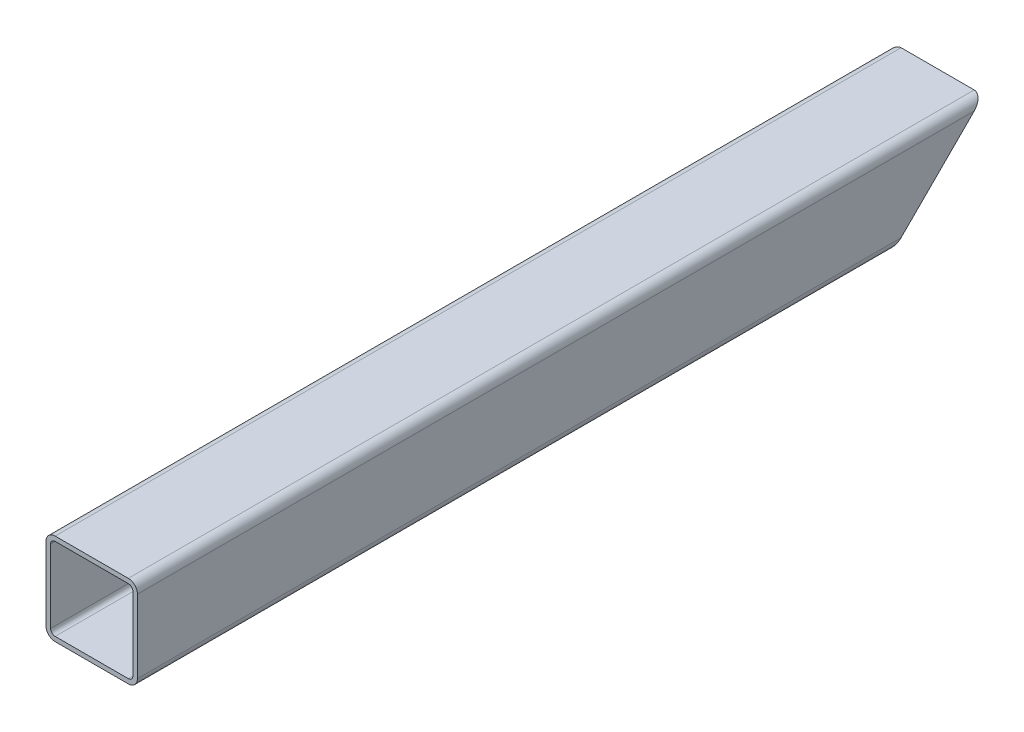
ISO-10303-21;
HEADER;
FILE_DESCRIPTION(('STEP AP214'),'2;1');
FILE_NAME('part.step','',(''),(''),'','','');
FILE_SCHEMA(('AUTOMOTIVE_DESIGN { 1 0 10303 214 1 1 1 1 }'));
ENDSEC;
DATA;
#1=APPLICATION_CONTEXT('core data for automotive mechanical design processes');
#2=APPLICATION_PROTOCOL_DEFINITION('international standard','automotive_design',2000,#1);
#3=PRODUCT_CONTEXT('',#1,'mechanical');
#4=PRODUCT('Part','Part','',(#3));
#5=PRODUCT_RELATED_PRODUCT_CATEGORY('part','',(#4));
#6=PRODUCT_DEFINITION_FORMATION('','',#4);
#7=PRODUCT_DEFINITION_CONTEXT('part definition',#1,'design');
#8=PRODUCT_DEFINITION('design','',#6,#7);
#9=PRODUCT_DEFINITION_SHAPE('','',#8);
#10=(LENGTH_UNIT() NAMED_UNIT(*) SI_UNIT(.MILLI.,.METRE.));
#11=(NAMED_UNIT(*) PLANE_ANGLE_UNIT() SI_UNIT($,.RADIAN.));
#12=(NAMED_UNIT(*) SI_UNIT($,.STERADIAN.) SOLID_ANGLE_UNIT());
#13=UNCERTAINTY_MEASURE_WITH_UNIT(LENGTH_MEASURE(1.E-05),#10,'distance_accuracy_value','');
#14=(GEOMETRIC_REPRESENTATION_CONTEXT(3) GLOBAL_UNCERTAINTY_ASSIGNED_CONTEXT((#13)) GLOBAL_UNIT_ASSIGNED_CONTEXT((#10,
#11,#12)) REPRESENTATION_CONTEXT('',''));
#15=CARTESIAN_POINT('',(0.,0.,0.));
#16=DIRECTION('',(0.,0.,1.));
#17=DIRECTION('',(1.,0.,0.));
#18=AXIS2_PLACEMENT_3D('',#15,#16,#17);
#19=CARTESIAN_POINT('',(16.,-16.,-370.));
#20=DIRECTION('',(0.,0.,1.));
#21=DIRECTION('',(-1.,0.,0.));
#22=AXIS2_PLACEMENT_3D('',#19,#20,#21);
#23=CYLINDRICAL_SURFACE('',#22,4.);
#24=CARTESIAN_POINT('',(16.,-16.,-334.));
#25=DIRECTION('',(0.,0.707106781186544,0.707106781186551));
#26=DIRECTION('',(0.,-0.707106781186551,0.707106781186544));
#27=AXIS2_PLACEMENT_3D('',#24,#25,#26);
#28=ELLIPSE('',#27,5.65685424949235,4.);
#29=CARTESIAN_POINT('',(16.,-20.,-330.));
#30=VERTEX_POINT('',#29);
#31=CARTESIAN_POINT('',(20.,-16.,-334.));
#32=VERTEX_POINT('',#31);
#33=EDGE_CURVE('E159',#30,#32,#28,.T.);
#34=ORIENTED_EDGE('',*,*,#33,.T.);
#35=DIRECTION('',(0.,0.,1.));
#36=VECTOR('',#35,1.);
#37=CARTESIAN_POINT('',(20.,-16.,-370.));
#38=LINE('',#37,#36);
#39=CARTESIAN_POINT('',(20.,-16.,0.));
#40=VERTEX_POINT('',#39);
#41=EDGE_CURVE('E44',#32,#40,#38,.T.);
#42=ORIENTED_EDGE('',*,*,#41,.T.);
#43=CARTESIAN_POINT('',(16.,-16.,0.));
#44=DIRECTION('',(0.,0.,1.));
#45=DIRECTION('',(-1.,0.,0.));
#46=AXIS2_PLACEMENT_3D('',#43,#44,#45);
#47=CIRCLE('',#46,4.);
#48=CARTESIAN_POINT('',(16.,-20.,0.));
#49=VERTEX_POINT('',#48);
#50=EDGE_CURVE('E161',#49,#40,#47,.T.);
#51=ORIENTED_EDGE('',*,*,#50,.F.);
#52=DIRECTION('',(0.,0.,1.));
#53=VECTOR('',#52,1.);
#54=CARTESIAN_POINT('',(16.,-20.,-370.));
#55=LINE('',#54,#53);
#56=EDGE_CURVE('E149',#30,#49,#55,.T.);
#57=ORIENTED_EDGE('',*,*,#56,.F.);
#58=EDGE_LOOP('',(#34,#42,#51,#57));
#59=FACE_BOUND('',#58,.T.);
#60=ADVANCED_FACE('F37',(#59),#23,.T.);
#61=CARTESIAN_POINT('',(20.,16.,-370.));
#62=DIRECTION('',(-1.,0.,0.));
#63=DIRECTION('',(0.,-1.,0.));
#64=AXIS2_PLACEMENT_3D('',#61,#62,#63);
#65=PLANE('',#64);
#66=DIRECTION('',(0.,0.707106781186551,-0.707106781186544));
#67=VECTOR('',#66,1.);
#68=CARTESIAN_POINT('',(20.,18.,-368.));
#69=LINE('',#68,#67);
#70=CARTESIAN_POINT('',(20.,16.,-366.));
#71=VERTEX_POINT('',#70);
#72=EDGE_CURVE('E166',#32,#71,#69,.T.);
#73=ORIENTED_EDGE('',*,*,#72,.T.);
#74=DIRECTION('',(0.,0.,1.));
#75=VECTOR('',#74,1.);
#76=CARTESIAN_POINT('',(20.,16.,-370.));
#77=LINE('',#76,#75);
#78=CARTESIAN_POINT('',(20.,16.,0.));
#79=VERTEX_POINT('',#78);
#80=EDGE_CURVE('E254',#71,#79,#77,.T.);
#81=ORIENTED_EDGE('',*,*,#80,.T.);
#82=DIRECTION('',(0.,1.,0.));
#83=VECTOR('',#82,1.);
#84=CARTESIAN_POINT('',(20.,16.,0.));
#85=LINE('',#84,#83);
#86=EDGE_CURVE('E223',#40,#79,#85,.T.);
#87=ORIENTED_EDGE('',*,*,#86,.F.);
#88=ORIENTED_EDGE('',*,*,#41,.F.);
#89=EDGE_LOOP('',(#73,#81,#87,#88));
#90=FACE_BOUND('',#89,.T.);
#91=ADVANCED_FACE('F257',(#90),#65,.F.);
#92=CARTESIAN_POINT('',(16.,16.,-370.));
#93=DIRECTION('',(0.,0.,1.));
#94=DIRECTION('',(-1.,0.,0.));
#95=AXIS2_PLACEMENT_3D('',#92,#93,#94);
#96=CYLINDRICAL_SURFACE('',#95,4.);
#97=CARTESIAN_POINT('',(16.,16.,-366.));
#98=DIRECTION('',(0.,0.707106781186544,0.707106781186551));
#99=DIRECTION('',(0.,-0.707106781186551,0.707106781186544));
#100=AXIS2_PLACEMENT_3D('',#97,#98,#99);
#101=ELLIPSE('',#100,5.65685424949235,4.);
#102=CARTESIAN_POINT('',(16.,20.,-370.));
#103=VERTEX_POINT('',#102);
#104=EDGE_CURVE('E173',#71,#103,#101,.T.);
#105=ORIENTED_EDGE('',*,*,#104,.T.);
#106=DIRECTION('',(0.,0.,1.));
#107=VECTOR('',#106,1.);
#108=CARTESIAN_POINT('',(16.,20.,-370.));
#109=LINE('',#108,#107);
#110=CARTESIAN_POINT('',(16.,20.,0.));
#111=VERTEX_POINT('',#110);
#112=EDGE_CURVE('E251',#103,#111,#109,.T.);
#113=ORIENTED_EDGE('',*,*,#112,.T.);
#114=CARTESIAN_POINT('',(16.,16.,0.));
#115=DIRECTION('',(0.,0.,1.));
#116=DIRECTION('',(-1.,0.,0.));
#117=AXIS2_PLACEMENT_3D('',#114,#115,#116);
#118=CIRCLE('',#117,4.);
#119=EDGE_CURVE('E226',#79,#111,#118,.T.);
#120=ORIENTED_EDGE('',*,*,#119,.F.);
#121=ORIENTED_EDGE('',*,*,#80,.F.);
#122=EDGE_LOOP('',(#105,#113,#120,#121));
#123=FACE_BOUND('',#122,.T.);
#124=ADVANCED_FACE('F279',(#123),#96,.T.);
#125=CARTESIAN_POINT('',(-16.,16.,-370.));
#126=DIRECTION('',(0.,0.,1.));
#127=DIRECTION('',(-1.,0.,0.));
#128=AXIS2_PLACEMENT_3D('',#125,#126,#127);
#129=CYLINDRICAL_SURFACE('',#128,4.);
#130=CARTESIAN_POINT('',(-16.,16.,-366.));
#131=DIRECTION('',(0.,0.707106781186544,0.707106781186551));
#132=DIRECTION('',(0.,-0.707106781186551,0.707106781186544));
#133=AXIS2_PLACEMENT_3D('',#130,#131,#132);
#134=ELLIPSE('',#133,5.65685424949235,4.);
#135=CARTESIAN_POINT('',(-16.,20.,-370.));
#136=VERTEX_POINT('',#135);
#137=CARTESIAN_POINT('',(-20.,16.,-366.));
#138=VERTEX_POINT('',#137);
#139=EDGE_CURVE('E270',#136,#138,#134,.T.);
#140=ORIENTED_EDGE('',*,*,#139,.T.);
#141=DIRECTION('',(0.,0.,1.));
#142=VECTOR('',#141,1.);
#143=CARTESIAN_POINT('',(-20.,16.,-370.));
#144=LINE('',#143,#142);
#145=CARTESIAN_POINT('',(-20.,16.,0.));
#146=VERTEX_POINT('',#145);
#147=EDGE_CURVE('E245',#138,#146,#144,.T.);
#148=ORIENTED_EDGE('',*,*,#147,.T.);
#149=CARTESIAN_POINT('',(-16.,16.,0.));
#150=DIRECTION('',(0.,0.,1.));
#151=DIRECTION('',(1.,0.,0.));
#152=AXIS2_PLACEMENT_3D('',#149,#150,#151);
#153=CIRCLE('',#152,4.);
#154=CARTESIAN_POINT('',(-16.,20.,0.));
#155=VERTEX_POINT('',#154);
#156=EDGE_CURVE('E231',#155,#146,#153,.T.);
#157=ORIENTED_EDGE('',*,*,#156,.F.);
#158=DIRECTION('',(0.,0.,1.));
#159=VECTOR('',#158,1.);
#160=CARTESIAN_POINT('',(-16.,20.,-370.));
#161=LINE('',#160,#159);
#162=EDGE_CURVE('E248',#136,#155,#161,.T.);
#163=ORIENTED_EDGE('',*,*,#162,.F.);
#164=EDGE_LOOP('',(#140,#148,#157,#163));
#165=FACE_BOUND('',#164,.T.);
#166=ADVANCED_FACE('F288',(#165),#129,.T.);
#167=CARTESIAN_POINT('',(-20.,16.,-370.));
#168=DIRECTION('',(1.,0.,0.));
#169=DIRECTION('',(0.,1.,0.));
#170=AXIS2_PLACEMENT_3D('',#167,#168,#169);
#171=PLANE('',#170);
#172=DIRECTION('',(0.,-0.707106781186551,0.707106781186544));
#173=VECTOR('',#172,1.);
#174=CARTESIAN_POINT('',(-20.,18.,-368.));
#175=LINE('',#174,#173);
#176=CARTESIAN_POINT('',(-20.,-16.,-334.));
#177=VERTEX_POINT('',#176);
#178=EDGE_CURVE('E267',#138,#177,#175,.T.);
#179=ORIENTED_EDGE('',*,*,#178,.T.);
#180=DIRECTION('',(0.,0.,1.));
#181=VECTOR('',#180,1.);
#182=CARTESIAN_POINT('',(-20.,-16.,-370.));
#183=LINE('',#182,#181);
#184=CARTESIAN_POINT('',(-20.,-16.,0.));
#185=VERTEX_POINT('',#184);
#186=EDGE_CURVE('E242',#177,#185,#183,.T.);
#187=ORIENTED_EDGE('',*,*,#186,.T.);
#188=DIRECTION('',(0.,-1.,0.));
#189=VECTOR('',#188,1.);
#190=CARTESIAN_POINT('',(-20.,16.,0.));
#191=LINE('',#190,#189);
#192=EDGE_CURVE('E234',#146,#185,#191,.T.);
#193=ORIENTED_EDGE('',*,*,#192,.F.);
#194=ORIENTED_EDGE('',*,*,#147,.F.);
#195=EDGE_LOOP('',(#179,#187,#193,#194));
#196=FACE_BOUND('',#195,.T.);
#197=ADVANCED_FACE('F290',(#196),#171,.F.);
#198=CARTESIAN_POINT('',(-16.,-16.,-370.));
#199=DIRECTION('',(0.,0.,1.));
#200=DIRECTION('',(-1.,0.,0.));
#201=AXIS2_PLACEMENT_3D('',#198,#199,#200);
#202=CYLINDRICAL_SURFACE('',#201,4.);
#203=CARTESIAN_POINT('',(-16.,-16.,-334.));
#204=DIRECTION('',(0.,0.707106781186544,0.707106781186551));
#205=DIRECTION('',(0.,-0.707106781186551,0.707106781186544));
#206=AXIS2_PLACEMENT_3D('',#203,#204,#205);
#207=ELLIPSE('',#206,5.65685424949236,4.);
#208=CARTESIAN_POINT('',(-16.,-20.,-330.));
#209=VERTEX_POINT('',#208);
#210=EDGE_CURVE('E265',#177,#209,#207,.T.);
#211=ORIENTED_EDGE('',*,*,#210,.T.);
#212=DIRECTION('',(0.,0.,1.));
#213=VECTOR('',#212,1.);
#214=CARTESIAN_POINT('',(-16.,-20.,-370.));
#215=LINE('',#214,#213);
#216=CARTESIAN_POINT('',(-16.,-20.,0.));
#217=VERTEX_POINT('',#216);
#218=EDGE_CURVE('E152',#209,#217,#215,.T.);
#219=ORIENTED_EDGE('',*,*,#218,.T.);
#220=CARTESIAN_POINT('',(-16.,-16.,0.));
#221=DIRECTION('',(0.,0.,1.));
#222=DIRECTION('',(1.,0.,0.));
#223=AXIS2_PLACEMENT_3D('',#220,#221,#222);
#224=CIRCLE('',#223,4.);
#225=EDGE_CURVE('E237',#185,#217,#224,.T.);
#226=ORIENTED_EDGE('',*,*,#225,.F.);
#227=ORIENTED_EDGE('',*,*,#186,.F.);
#228=EDGE_LOOP('',(#211,#219,#226,#227));
#229=FACE_BOUND('',#228,.T.);
#230=ADVANCED_FACE('F264',(#229),#202,.T.);
#231=CARTESIAN_POINT('',(-16.,-20.,-370.));
#232=DIRECTION('',(0.,1.,0.));
#233=DIRECTION('',(0.,0.,-1.));
#234=AXIS2_PLACEMENT_3D('',#231,#232,#233);
#235=PLANE('',#234);
#236=DIRECTION('',(-1.,0.,0.));
#237=VECTOR('',#236,1.);
#238=CARTESIAN_POINT('',(41.,-20.,-330.));
#239=LINE('',#238,#237);
#240=EDGE_CURVE('E51',#30,#209,#239,.T.);
#241=ORIENTED_EDGE('',*,*,#240,.F.);
#242=ORIENTED_EDGE('',*,*,#56,.T.);
#243=DIRECTION('',(1.,0.,0.));
#244=VECTOR('',#243,1.);
#245=CARTESIAN_POINT('',(-16.,-20.,0.));
#246=LINE('',#245,#244);
#247=EDGE_CURVE('E221',#217,#49,#246,.T.);
#248=ORIENTED_EDGE('',*,*,#247,.F.);
#249=ORIENTED_EDGE('',*,*,#218,.F.);
#250=EDGE_LOOP('',(#241,#242,#248,#249));
#251=FACE_BOUND('',#250,.T.);
#252=ADVANCED_FACE('F148',(#251),#235,.F.);
#253=CARTESIAN_POINT('',(-16.,16.,-370.));
#254=DIRECTION('',(0.,0.,1.));
#255=DIRECTION('',(-1.,0.,0.));
#256=AXIS2_PLACEMENT_3D('',#253,#254,#255);
#257=CYLINDRICAL_SURFACE('',#256,2.);
#258=DIRECTION('',(0.,0.,1.));
#259=VECTOR('',#258,1.);
#260=CARTESIAN_POINT('',(-16.,18.,-370.));
#261=LINE('',#260,#259);
#262=CARTESIAN_POINT('',(-16.,18.,-368.));
#263=VERTEX_POINT('',#262);
#264=CARTESIAN_POINT('',(-16.,18.,0.));
#265=VERTEX_POINT('',#264);
#266=EDGE_CURVE('E196',#263,#265,#261,.T.);
#267=ORIENTED_EDGE('',*,*,#266,.T.);
#268=CARTESIAN_POINT('',(-16.,16.,0.));
#269=DIRECTION('',(0.,0.,1.));
#270=DIRECTION('',(1.,0.,0.));
#271=AXIS2_PLACEMENT_3D('',#268,#269,#270);
#272=CIRCLE('',#271,2.);
#273=CARTESIAN_POINT('',(-18.,16.,0.));
#274=VERTEX_POINT('',#273);
#275=EDGE_CURVE('E168',#265,#274,#272,.T.);
#276=ORIENTED_EDGE('',*,*,#275,.T.);
#277=DIRECTION('',(0.,0.,1.));
#278=VECTOR('',#277,1.);
#279=CARTESIAN_POINT('',(-18.,16.,-370.));
#280=LINE('',#279,#278);
#281=CARTESIAN_POINT('',(-18.,16.,-366.));
#282=VERTEX_POINT('',#281);
#283=EDGE_CURVE('E217',#282,#274,#280,.T.);
#284=ORIENTED_EDGE('',*,*,#283,.F.);
#285=CARTESIAN_POINT('',(-16.,16.,-366.));
#286=DIRECTION('',(0.,0.707106781186544,0.707106781186551));
#287=DIRECTION('',(0.,-0.707106781186551,0.707106781186544));
#288=AXIS2_PLACEMENT_3D('',#285,#286,#287);
#289=ELLIPSE('',#288,2.82842712474617,2.);
#290=EDGE_CURVE('E268',#263,#282,#289,.T.);
#291=ORIENTED_EDGE('',*,*,#290,.F.);
#292=EDGE_LOOP('',(#267,#276,#284,#291));
#293=FACE_BOUND('',#292,.T.);
#294=ADVANCED_FACE('F324',(#293),#257,.F.);
#295=CARTESIAN_POINT('',(-18.,16.,-370.));
#296=DIRECTION('',(1.,0.,0.));
#297=DIRECTION('',(0.,1.,0.));
#298=AXIS2_PLACEMENT_3D('',#295,#296,#297);
#299=PLANE('',#298);
#300=ORIENTED_EDGE('',*,*,#283,.T.);
#301=DIRECTION('',(0.,-1.,0.));
#302=VECTOR('',#301,1.);
#303=CARTESIAN_POINT('',(-18.,16.,0.));
#304=LINE('',#303,#302);
#305=CARTESIAN_POINT('',(-18.,-16.,0.));
#306=VERTEX_POINT('',#305);
#307=EDGE_CURVE('E171',#274,#306,#304,.T.);
#308=ORIENTED_EDGE('',*,*,#307,.T.);
#309=DIRECTION('',(0.,0.,1.));
#310=VECTOR('',#309,1.);
#311=CARTESIAN_POINT('',(-18.,-16.,-370.));
#312=LINE('',#311,#310);
#313=CARTESIAN_POINT('',(-18.,-16.,-334.));
#314=VERTEX_POINT('',#313);
#315=EDGE_CURVE('E214',#314,#306,#312,.T.);
#316=ORIENTED_EDGE('',*,*,#315,.F.);
#317=DIRECTION('',(0.,-0.707106781186551,0.707106781186544));
#318=VECTOR('',#317,1.);
#319=CARTESIAN_POINT('',(-18.,18.,-368.));
#320=LINE('',#319,#318);
#321=EDGE_CURVE('E272',#282,#314,#320,.T.);
#322=ORIENTED_EDGE('',*,*,#321,.F.);
#323=EDGE_LOOP('',(#300,#308,#316,#322));
#324=FACE_BOUND('',#323,.T.);
#325=ADVANCED_FACE('F330',(#324),#299,.T.);
#326=CARTESIAN_POINT('',(-16.,-16.,-370.));
#327=DIRECTION('',(0.,0.,1.));
#328=DIRECTION('',(-1.,0.,0.));
#329=AXIS2_PLACEMENT_3D('',#326,#327,#328);
#330=CYLINDRICAL_SURFACE('',#329,2.);
#331=ORIENTED_EDGE('',*,*,#315,.T.);
#332=CARTESIAN_POINT('',(-16.,-16.,0.));
#333=DIRECTION('',(0.,0.,1.));
#334=DIRECTION('',(1.,0.,0.));
#335=AXIS2_PLACEMENT_3D('',#332,#333,#334);
#336=CIRCLE('',#335,2.);
#337=CARTESIAN_POINT('',(-16.,-18.,0.));
#338=VERTEX_POINT('',#337);
#339=EDGE_CURVE('E179',#306,#338,#336,.T.);
#340=ORIENTED_EDGE('',*,*,#339,.T.);
#341=DIRECTION('',(0.,0.,1.));
#342=VECTOR('',#341,1.);
#343=CARTESIAN_POINT('',(-16.,-18.,-370.));
#344=LINE('',#343,#342);
#345=CARTESIAN_POINT('',(-16.,-18.,-332.));
#346=VERTEX_POINT('',#345);
#347=EDGE_CURVE('E211',#346,#338,#344,.T.);
#348=ORIENTED_EDGE('',*,*,#347,.F.);
#349=CARTESIAN_POINT('',(-16.,-16.,-334.));
#350=DIRECTION('',(0.,0.707106781186544,0.707106781186551));
#351=DIRECTION('',(0.,-0.707106781186551,0.707106781186544));
#352=AXIS2_PLACEMENT_3D('',#349,#350,#351);
#353=ELLIPSE('',#352,2.82842712474618,2.);
#354=EDGE_CURVE('E344',#314,#346,#353,.T.);
#355=ORIENTED_EDGE('',*,*,#354,.F.);
#356=EDGE_LOOP('',(#331,#340,#348,#355));
#357=FACE_BOUND('',#356,.T.);
#358=ADVANCED_FACE('F335',(#357),#330,.F.);
#359=CARTESIAN_POINT('',(-16.,-18.,-370.));
#360=DIRECTION('',(0.,1.,0.));
#361=DIRECTION('',(0.,0.,-1.));
#362=AXIS2_PLACEMENT_3D('',#359,#360,#361);
#363=PLANE('',#362);
#364=ORIENTED_EDGE('',*,*,#347,.T.);
#365=DIRECTION('',(1.,0.,0.));
#366=VECTOR('',#365,1.);
#367=CARTESIAN_POINT('',(-16.,-18.,0.));
#368=LINE('',#367,#366);
#369=CARTESIAN_POINT('',(16.,-18.,0.));
#370=VERTEX_POINT('',#369);
#371=EDGE_CURVE('E182',#338,#370,#368,.T.);
#372=ORIENTED_EDGE('',*,*,#371,.T.);
#373=DIRECTION('',(0.,0.,1.));
#374=VECTOR('',#373,1.);
#375=CARTESIAN_POINT('',(16.,-18.,-370.));
#376=LINE('',#375,#374);
#377=CARTESIAN_POINT('',(16.,-18.,-332.));
#378=VERTEX_POINT('',#377);
#379=EDGE_CURVE('E208',#378,#370,#376,.T.);
#380=ORIENTED_EDGE('',*,*,#379,.F.);
#381=DIRECTION('',(1.,0.,0.));
#382=VECTOR('',#381,1.);
#383=CARTESIAN_POINT('',(-16.,-18.,-332.));
#384=LINE('',#383,#382);
#385=EDGE_CURVE('E345',#346,#378,#384,.T.);
#386=ORIENTED_EDGE('',*,*,#385,.F.);
#387=EDGE_LOOP('',(#364,#372,#380,#386));
#388=FACE_BOUND('',#387,.T.);
#389=ADVANCED_FACE('F365',(#388),#363,.T.);
#390=CARTESIAN_POINT('',(16.,-16.,-370.));
#391=DIRECTION('',(0.,0.,1.));
#392=DIRECTION('',(-1.,0.,0.));
#393=AXIS2_PLACEMENT_3D('',#390,#391,#392);
#394=CYLINDRICAL_SURFACE('',#393,2.);
#395=ORIENTED_EDGE('',*,*,#379,.T.);
#396=CARTESIAN_POINT('',(16.,-16.,0.));
#397=DIRECTION('',(0.,0.,1.));
#398=DIRECTION('',(-1.,0.,0.));
#399=AXIS2_PLACEMENT_3D('',#396,#397,#398);
#400=CIRCLE('',#399,2.);
#401=CARTESIAN_POINT('',(18.,-16.,0.));
#402=VERTEX_POINT('',#401);
#403=EDGE_CURVE('E185',#370,#402,#400,.T.);
#404=ORIENTED_EDGE('',*,*,#403,.T.);
#405=DIRECTION('',(0.,0.,1.));
#406=VECTOR('',#405,1.);
#407=CARTESIAN_POINT('',(18.,-16.,-370.));
#408=LINE('',#407,#406);
#409=CARTESIAN_POINT('',(18.,-16.,-334.));
#410=VERTEX_POINT('',#409);
#411=EDGE_CURVE('E205',#410,#402,#408,.T.);
#412=ORIENTED_EDGE('',*,*,#411,.F.);
#413=CARTESIAN_POINT('',(16.,-16.,-334.));
#414=DIRECTION('',(0.,0.707106781186544,0.707106781186551));
#415=DIRECTION('',(0.,-0.707106781186551,0.707106781186544));
#416=AXIS2_PLACEMENT_3D('',#413,#414,#415);
#417=ELLIPSE('',#416,2.82842712474618,2.);
#418=EDGE_CURVE('E350',#378,#410,#417,.T.);
#419=ORIENTED_EDGE('',*,*,#418,.F.);
#420=EDGE_LOOP('',(#395,#404,#412,#419));
#421=FACE_BOUND('',#420,.T.);
#422=ADVANCED_FACE('F362',(#421),#394,.F.);
#423=CARTESIAN_POINT('',(18.,16.,-370.));
#424=DIRECTION('',(-1.,0.,0.));
#425=DIRECTION('',(0.,0.,-1.));
#426=AXIS2_PLACEMENT_3D('',#423,#424,#425);
#427=PLANE('',#426);
#428=ORIENTED_EDGE('',*,*,#411,.T.);
#429=DIRECTION('',(0.,1.,0.));
#430=VECTOR('',#429,1.);
#431=CARTESIAN_POINT('',(18.,16.,0.));
#432=LINE('',#431,#430);
#433=CARTESIAN_POINT('',(18.,16.,0.));
#434=VERTEX_POINT('',#433);
#435=EDGE_CURVE('E188',#402,#434,#432,.T.);
#436=ORIENTED_EDGE('',*,*,#435,.T.);
#437=DIRECTION('',(0.,0.,1.));
#438=VECTOR('',#437,1.);
#439=CARTESIAN_POINT('',(18.,16.,-370.));
#440=LINE('',#439,#438);
#441=CARTESIAN_POINT('',(18.,16.,-366.));
#442=VERTEX_POINT('',#441);
#443=EDGE_CURVE('E202',#442,#434,#440,.T.);
#444=ORIENTED_EDGE('',*,*,#443,.F.);
#445=DIRECTION('',(0.,0.707106781186551,-0.707106781186544));
#446=VECTOR('',#445,1.);
#447=CARTESIAN_POINT('',(18.,18.,-368.));
#448=LINE('',#447,#446);
#449=EDGE_CURVE('E353',#410,#442,#448,.T.);
#450=ORIENTED_EDGE('',*,*,#449,.F.);
#451=EDGE_LOOP('',(#428,#436,#444,#450));
#452=FACE_BOUND('',#451,.T.);
#453=ADVANCED_FACE('F360',(#452),#427,.T.);
#454=CARTESIAN_POINT('',(16.,16.,-370.));
#455=DIRECTION('',(0.,0.,1.));
#456=DIRECTION('',(-1.,0.,0.));
#457=AXIS2_PLACEMENT_3D('',#454,#455,#456);
#458=CYLINDRICAL_SURFACE('',#457,2.);
#459=ORIENTED_EDGE('',*,*,#443,.T.);
#460=CARTESIAN_POINT('',(16.,16.,0.));
#461=DIRECTION('',(0.,0.,1.));
#462=DIRECTION('',(-1.,0.,0.));
#463=AXIS2_PLACEMENT_3D('',#460,#461,#462);
#464=CIRCLE('',#463,2.);
#465=CARTESIAN_POINT('',(16.,18.,0.));
#466=VERTEX_POINT('',#465);
#467=EDGE_CURVE('E191',#434,#466,#464,.T.);
#468=ORIENTED_EDGE('',*,*,#467,.T.);
#469=DIRECTION('',(0.,0.,1.));
#470=VECTOR('',#469,1.);
#471=CARTESIAN_POINT('',(16.,18.,-370.));
#472=LINE('',#471,#470);
#473=CARTESIAN_POINT('',(16.,18.,-368.));
#474=VERTEX_POINT('',#473);
#475=EDGE_CURVE('E199',#474,#466,#472,.T.);
#476=ORIENTED_EDGE('',*,*,#475,.F.);
#477=CARTESIAN_POINT('',(16.,16.,-366.));
#478=DIRECTION('',(0.,0.707106781186544,0.707106781186551));
#479=DIRECTION('',(0.,-0.707106781186551,0.707106781186544));
#480=AXIS2_PLACEMENT_3D('',#477,#478,#479);
#481=ELLIPSE('',#480,2.82842712474618,2.);
#482=EDGE_CURVE('E154',#442,#474,#481,.T.);
#483=ORIENTED_EDGE('',*,*,#482,.F.);
#484=EDGE_LOOP('',(#459,#468,#476,#483));
#485=FACE_BOUND('',#484,.T.);
#486=ADVANCED_FACE('F319',(#485),#458,.F.);
#487=CARTESIAN_POINT('',(-16.,18.,-370.));
#488=DIRECTION('',(0.,-1.,0.));
#489=DIRECTION('',(0.,0.,1.));
#490=AXIS2_PLACEMENT_3D('',#487,#488,#489);
#491=PLANE('',#490);
#492=ORIENTED_EDGE('',*,*,#475,.T.);
#493=DIRECTION('',(-1.,0.,0.));
#494=VECTOR('',#493,1.);
#495=CARTESIAN_POINT('',(-16.,18.,0.));
#496=LINE('',#495,#494);
#497=EDGE_CURVE('E194',#466,#265,#496,.T.);
#498=ORIENTED_EDGE('',*,*,#497,.T.);
#499=ORIENTED_EDGE('',*,*,#266,.F.);
#500=DIRECTION('',(-1.,0.,0.));
#501=VECTOR('',#500,1.);
#502=CARTESIAN_POINT('',(-16.,18.,-368.));
#503=LINE('',#502,#501);
#504=EDGE_CURVE('E11',#474,#263,#503,.T.);
#505=ORIENTED_EDGE('',*,*,#504,.F.);
#506=EDGE_LOOP('',(#492,#498,#499,#505));
#507=FACE_BOUND('',#506,.T.);
#508=ADVANCED_FACE('F314',(#507),#491,.T.);
#509=CARTESIAN_POINT('',(16.,-16.,0.));
#510=DIRECTION('',(0.,0.,1.));
#511=DIRECTION('',(-1.,0.,0.));
#512=AXIS2_PLACEMENT_3D('',#509,#510,#511);
#513=PLANE('',#512);
#514=ORIENTED_EDGE('',*,*,#50,.T.);
#515=ORIENTED_EDGE('',*,*,#86,.T.);
#516=ORIENTED_EDGE('',*,*,#119,.T.);
#517=DIRECTION('',(-1.,0.,0.));
#518=VECTOR('',#517,1.);
#519=CARTESIAN_POINT('',(-16.,20.,0.));
#520=LINE('',#519,#518);
#521=EDGE_CURVE('E229',#111,#155,#520,.T.);
#522=ORIENTED_EDGE('',*,*,#521,.T.);
#523=ORIENTED_EDGE('',*,*,#156,.T.);
#524=ORIENTED_EDGE('',*,*,#192,.T.);
#525=ORIENTED_EDGE('',*,*,#225,.T.);
#526=ORIENTED_EDGE('',*,*,#247,.T.);
#527=EDGE_LOOP('',(#514,#515,#516,#522,#523,#524,#525,#526));
#528=FACE_BOUND('',#527,.T.);
#529=ORIENTED_EDGE('',*,*,#497,.F.);
#530=ORIENTED_EDGE('',*,*,#467,.F.);
#531=ORIENTED_EDGE('',*,*,#435,.F.);
#532=ORIENTED_EDGE('',*,*,#403,.F.);
#533=ORIENTED_EDGE('',*,*,#371,.F.);
#534=ORIENTED_EDGE('',*,*,#339,.F.);
#535=ORIENTED_EDGE('',*,*,#307,.F.);
#536=ORIENTED_EDGE('',*,*,#275,.F.);
#537=EDGE_LOOP('',(#529,#530,#531,#532,#533,#534,#535,#536));
#538=FACE_BOUND('',#537,.T.);
#539=ADVANCED_FACE('F260',(#528,#538),#513,.T.);
#540=CARTESIAN_POINT('',(-16.,20.,-370.));
#541=DIRECTION('',(0.,-1.,0.));
#542=DIRECTION('',(0.,0.,1.));
#543=AXIS2_PLACEMENT_3D('',#540,#541,#542);
#544=PLANE('',#543);
#545=ORIENTED_EDGE('',*,*,#521,.F.);
#546=ORIENTED_EDGE('',*,*,#112,.F.);
#547=DIRECTION('',(-1.,0.,0.));
#548=VECTOR('',#547,1.);
#549=CARTESIAN_POINT('',(-16.,20.,-370.));
#550=LINE('',#549,#548);
#551=EDGE_CURVE('E162',#103,#136,#550,.T.);
#552=ORIENTED_EDGE('',*,*,#551,.T.);
#553=ORIENTED_EDGE('',*,*,#162,.T.);
#554=EDGE_LOOP('',(#545,#546,#552,#553));
#555=FACE_BOUND('',#554,.T.);
#556=ADVANCED_FACE('F284',(#555),#544,.F.);
#557=CARTESIAN_POINT('',(41.,20.,-370.));
#558=DIRECTION('',(0.,-0.707106781186544,-0.707106781186551));
#559=DIRECTION('',(0.,-0.707106781186551,0.707106781186544));
#560=AXIS2_PLACEMENT_3D('',#557,#558,#559);
#561=PLANE('',#560);
#562=ORIENTED_EDGE('',*,*,#504,.T.);
#563=ORIENTED_EDGE('',*,*,#290,.T.);
#564=ORIENTED_EDGE('',*,*,#321,.T.);
#565=ORIENTED_EDGE('',*,*,#354,.T.);
#566=ORIENTED_EDGE('',*,*,#385,.T.);
#567=ORIENTED_EDGE('',*,*,#418,.T.);
#568=ORIENTED_EDGE('',*,*,#449,.T.);
#569=ORIENTED_EDGE('',*,*,#482,.T.);
#570=EDGE_LOOP('',(#562,#563,#564,#565,#566,#567,#568,#569));
#571=FACE_BOUND('',#570,.T.);
#572=ORIENTED_EDGE('',*,*,#33,.F.);
#573=ORIENTED_EDGE('',*,*,#240,.T.);
#574=ORIENTED_EDGE('',*,*,#210,.F.);
#575=ORIENTED_EDGE('',*,*,#178,.F.);
#576=ORIENTED_EDGE('',*,*,#139,.F.);
#577=ORIENTED_EDGE('',*,*,#551,.F.);
#578=ORIENTED_EDGE('',*,*,#104,.F.);
#579=ORIENTED_EDGE('',*,*,#72,.F.);
#580=EDGE_LOOP('',(#572,#573,#574,#575,#576,#577,#578,#579));
#581=FACE_BOUND('',#580,.T.);
#582=ADVANCED_FACE('F164',(#571,#581),#561,.T.);
#583=CLOSED_SHELL('',(#60,#91,#124,#166,#197,#230,#252,#294,#325,#358,#389,#422,#453,#486,#508,
#539,#556,#582));
#584=MANIFOLD_SOLID_BREP('B2',#583);
#585=ADVANCED_BREP_SHAPE_REPRESENTATION('',(#18,#584),#14);
#586=SHAPE_DEFINITION_REPRESENTATION(#9,#585);
ENDSEC;
END-ISO-10303-21;
